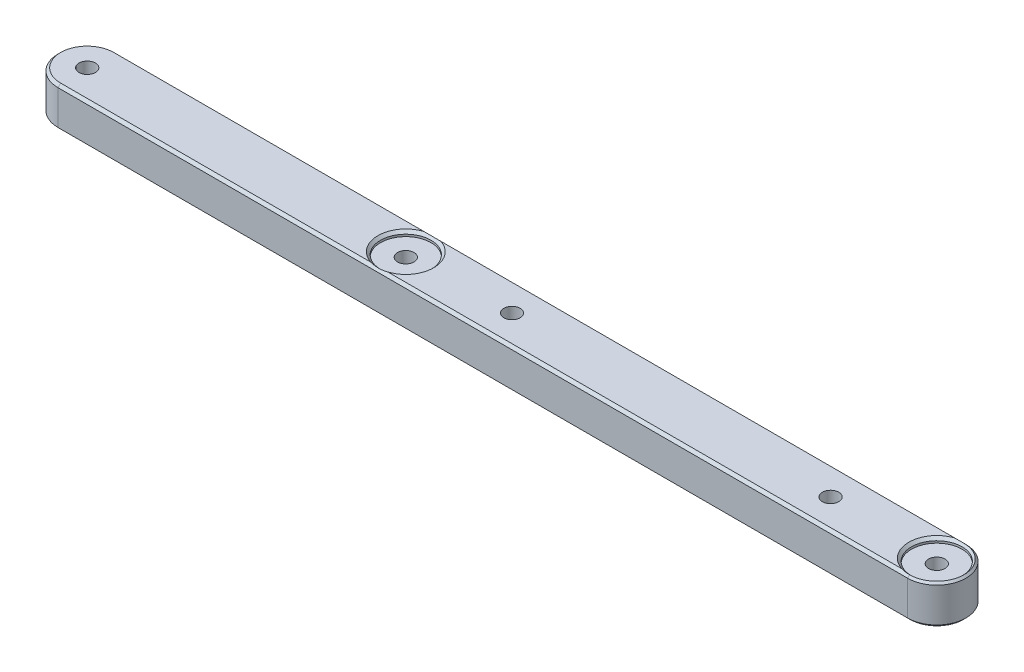
ISO-10303-21;
HEADER;
FILE_DESCRIPTION(('STEP AP214'),'2;1');
FILE_NAME('part.step','',(''),(''),'','','');
FILE_SCHEMA(('AUTOMOTIVE_DESIGN { 1 0 10303 214 1 1 1 1 }'));
ENDSEC;
DATA;
#1=APPLICATION_CONTEXT('core data for automotive mechanical design processes');
#2=APPLICATION_PROTOCOL_DEFINITION('international standard','automotive_design',2000,#1);
#3=PRODUCT_CONTEXT('',#1,'mechanical');
#4=PRODUCT('Part','Part','',(#3));
#5=PRODUCT_RELATED_PRODUCT_CATEGORY('part','',(#4));
#6=PRODUCT_DEFINITION_FORMATION('','',#4);
#7=PRODUCT_DEFINITION_CONTEXT('part definition',#1,'design');
#8=PRODUCT_DEFINITION('design','',#6,#7);
#9=PRODUCT_DEFINITION_SHAPE('','',#8);
#10=(LENGTH_UNIT() NAMED_UNIT(*) SI_UNIT(.MILLI.,.METRE.));
#11=(NAMED_UNIT(*) PLANE_ANGLE_UNIT() SI_UNIT($,.RADIAN.));
#12=(NAMED_UNIT(*) SI_UNIT($,.STERADIAN.) SOLID_ANGLE_UNIT());
#13=UNCERTAINTY_MEASURE_WITH_UNIT(LENGTH_MEASURE(1.E-05),#10,'distance_accuracy_value','');
#14=(GEOMETRIC_REPRESENTATION_CONTEXT(3) GLOBAL_UNCERTAINTY_ASSIGNED_CONTEXT((#13)) GLOBAL_UNIT_ASSIGNED_CONTEXT((#10,
#11,#12)) REPRESENTATION_CONTEXT('',''));
#15=CARTESIAN_POINT('',(0.,0.,0.));
#16=DIRECTION('',(0.,0.,1.));
#17=DIRECTION('',(1.,0.,0.));
#18=AXIS2_PLACEMENT_3D('',#15,#16,#17);
#19=CARTESIAN_POINT('',(-160.,15.,0.));
#20=DIRECTION('',(0.,1.,0.));
#21=DIRECTION('',(0.,0.,1.));
#22=AXIS2_PLACEMENT_3D('',#19,#20,#21);
#23=PLANE('',#22);
#24=CARTESIAN_POINT('',(0.,15.,0.));
#25=DIRECTION('',(0.,1.,0.));
#26=DIRECTION('',(0.,0.,1.));
#27=AXIS2_PLACEMENT_3D('',#24,#25,#26);
#28=CIRCLE('',#27,3.09999999999999);
#29=CARTESIAN_POINT('',(0.,15.,3.09999999999999));
#30=VERTEX_POINT('',#29);
#31=EDGE_CURVE('E543',#30,#30,#28,.T.);
#32=ORIENTED_EDGE('',*,*,#31,.F.);
#33=EDGE_LOOP('',(#32));
#34=FACE_BOUND('',#33,.T.);
#35=CARTESIAN_POINT('',(120.,15.,0.));
#36=DIRECTION('',(0.,1.,0.));
#37=DIRECTION('',(0.,0.,1.));
#38=AXIS2_PLACEMENT_3D('',#35,#36,#37);
#39=CIRCLE('',#38,3.09999999999999);
#40=CARTESIAN_POINT('',(120.,15.,3.09999999999999));
#41=VERTEX_POINT('',#40);
#42=EDGE_CURVE('E537',#41,#41,#39,.T.);
#43=ORIENTED_EDGE('',*,*,#42,.F.);
#44=EDGE_LOOP('',(#43));
#45=FACE_BOUND('',#44,.T.);
#46=CARTESIAN_POINT('',(-40.,15.,0.));
#47=DIRECTION('',(0.,1.,0.));
#48=DIRECTION('',(0.,0.,1.));
#49=AXIS2_PLACEMENT_3D('',#46,#47,#48);
#50=CIRCLE('',#49,10.5000000000001);
#51=CARTESIAN_POINT('',(-36.7984378812834,15.,-10.0000000000001));
#52=VERTEX_POINT('',#51);
#53=CARTESIAN_POINT('',(-36.7984378812833,15.,10.));
#54=VERTEX_POINT('',#53);
#55=EDGE_CURVE('E127',#52,#54,#50,.F.);
#56=ORIENTED_EDGE('',*,*,#55,.T.);
#57=DIRECTION('',(1.,0.,0.));
#58=VECTOR('',#57,1.);
#59=CARTESIAN_POINT('',(160.,15.,10.));
#60=LINE('',#59,#58);
#61=CARTESIAN_POINT('',(156.798437881283,15.,10.));
#62=VERTEX_POINT('',#61);
#63=EDGE_CURVE('E122',#54,#62,#60,.T.);
#64=ORIENTED_EDGE('',*,*,#63,.T.);
#65=CARTESIAN_POINT('',(160.,15.,0.));
#66=DIRECTION('',(0.,1.,0.));
#67=DIRECTION('',(0.,0.,1.));
#68=AXIS2_PLACEMENT_3D('',#65,#66,#67);
#69=CIRCLE('',#68,10.5000000000001);
#70=CARTESIAN_POINT('',(156.798437881283,15.,-10.0000000000001));
#71=VERTEX_POINT('',#70);
#72=EDGE_CURVE('E124',#62,#71,#69,.F.);
#73=ORIENTED_EDGE('',*,*,#72,.T.);
#74=DIRECTION('',(-1.,0.,0.));
#75=VECTOR('',#74,1.);
#76=CARTESIAN_POINT('',(-160.,15.,-10.0000000000001));
#77=LINE('',#76,#75);
#78=EDGE_CURVE('E131',#71,#52,#77,.T.);
#79=ORIENTED_EDGE('',*,*,#78,.T.);
#80=EDGE_LOOP('',(#56,#64,#73,#79));
#81=FACE_BOUND('',#80,.T.);
#82=ADVANCED_FACE('F35',(#34,#45,#81),#23,.T.);
#83=CARTESIAN_POINT('',(160.,15.,0.));
#84=DIRECTION('',(0.,-1.,0.));
#85=DIRECTION('',(0.,0.,-1.));
#86=AXIS2_PLACEMENT_3D('',#83,#84,#85);
#87=CYLINDRICAL_SURFACE('',#86,3.09999999999999);
#88=CARTESIAN_POINT('',(160.,0.,0.));
#89=DIRECTION('',(0.,1.,0.));
#90=DIRECTION('',(0.,0.,1.));
#91=AXIS2_PLACEMENT_3D('',#88,#89,#90);
#92=CIRCLE('',#91,3.09999999999999);
#93=CARTESIAN_POINT('',(160.,0.,3.09999999999993));
#94=VERTEX_POINT('',#93);
#95=EDGE_CURVE('E273',#94,#94,#92,.T.);
#96=ORIENTED_EDGE('',*,*,#95,.F.);
#97=EDGE_LOOP('',(#96));
#98=FACE_BOUND('',#97,.T.);
#99=CARTESIAN_POINT('',(160.,13.2,0.));
#100=DIRECTION('',(0.,1.,0.));
#101=DIRECTION('',(0.,0.,1.));
#102=AXIS2_PLACEMENT_3D('',#99,#100,#101);
#103=CIRCLE('',#102,3.09999999999999);
#104=CARTESIAN_POINT('',(160.,13.2,3.09999999999993));
#105=VERTEX_POINT('',#104);
#106=EDGE_CURVE('E290',#105,#105,#103,.T.);
#107=ORIENTED_EDGE('',*,*,#106,.T.);
#108=EDGE_LOOP('',(#107));
#109=FACE_BOUND('',#108,.T.);
#110=ADVANCED_FACE('F232',(#98,#109),#87,.F.);
#111=CARTESIAN_POINT('',(-40.,15.,0.));
#112=DIRECTION('',(0.,-1.,0.));
#113=DIRECTION('',(0.,0.,-1.));
#114=AXIS2_PLACEMENT_3D('',#111,#112,#113);
#115=CYLINDRICAL_SURFACE('',#114,3.1);
#116=CARTESIAN_POINT('',(-40.,0.,0.));
#117=DIRECTION('',(0.,1.,0.));
#118=DIRECTION('',(0.,0.,1.));
#119=AXIS2_PLACEMENT_3D('',#116,#117,#118);
#120=CIRCLE('',#119,3.1);
#121=CARTESIAN_POINT('',(-40.,0.,3.1));
#122=VERTEX_POINT('',#121);
#123=EDGE_CURVE('E294',#122,#122,#120,.T.);
#124=ORIENTED_EDGE('',*,*,#123,.F.);
#125=EDGE_LOOP('',(#124));
#126=FACE_BOUND('',#125,.T.);
#127=CARTESIAN_POINT('',(-40.,13.2,0.));
#128=DIRECTION('',(0.,1.,0.));
#129=DIRECTION('',(0.,0.,1.));
#130=AXIS2_PLACEMENT_3D('',#127,#128,#129);
#131=CIRCLE('',#130,3.1);
#132=CARTESIAN_POINT('',(-40.,13.2,3.1));
#133=VERTEX_POINT('',#132);
#134=EDGE_CURVE('E287',#133,#133,#131,.T.);
#135=ORIENTED_EDGE('',*,*,#134,.T.);
#136=EDGE_LOOP('',(#135));
#137=FACE_BOUND('',#136,.T.);
#138=ADVANCED_FACE('F239',(#126,#137),#115,.F.);
#139=CARTESIAN_POINT('',(-160.,15.,0.));
#140=DIRECTION('',(0.,1.,0.));
#141=DIRECTION('',(0.,0.,1.));
#142=AXIS2_PLACEMENT_3D('',#139,#140,#141);
#143=CIRCLE('',#142,10.0000000000001);
#144=CARTESIAN_POINT('',(-160.,15.,-10.0000000000001));
#145=VERTEX_POINT('',#144);
#146=CARTESIAN_POINT('',(-160.,15.,10.0000000000001));
#147=VERTEX_POINT('',#146);
#148=EDGE_CURVE('E260',#145,#147,#143,.T.);
#149=ORIENTED_EDGE('',*,*,#148,.T.);
#150=DIRECTION('',(1.,0.,0.));
#151=VECTOR('',#150,1.);
#152=CARTESIAN_POINT('',(160.,15.,10.));
#153=LINE('',#152,#151);
#154=CARTESIAN_POINT('',(-43.2015621187167,15.,10.));
#155=VERTEX_POINT('',#154);
#156=EDGE_CURVE('E304',#147,#155,#153,.T.);
#157=ORIENTED_EDGE('',*,*,#156,.T.);
#158=CARTESIAN_POINT('',(-43.2015621187166,15.,-10.0000000000001));
#159=VERTEX_POINT('',#158);
#160=EDGE_CURVE('E141',#155,#159,#50,.F.);
#161=ORIENTED_EDGE('',*,*,#160,.T.);
#162=DIRECTION('',(-1.,0.,0.));
#163=VECTOR('',#162,1.);
#164=CARTESIAN_POINT('',(-160.,15.,-10.0000000000001));
#165=LINE('',#164,#163);
#166=EDGE_CURVE('E301',#159,#145,#165,.T.);
#167=ORIENTED_EDGE('',*,*,#166,.T.);
#168=EDGE_LOOP('',(#149,#157,#161,#167));
#169=FACE_BOUND('',#168,.T.);
#170=CARTESIAN_POINT('',(-160.,15.,0.));
#171=DIRECTION('',(0.,1.,0.));
#172=DIRECTION('',(0.,0.,1.));
#173=AXIS2_PLACEMENT_3D('',#170,#171,#172);
#174=CIRCLE('',#173,3.09999999999999);
#175=CARTESIAN_POINT('',(-160.,15.,3.09999999999999));
#176=VERTEX_POINT('',#175);
#177=EDGE_CURVE('E264',#176,#176,#174,.T.);
#178=ORIENTED_EDGE('',*,*,#177,.F.);
#179=EDGE_LOOP('',(#178));
#180=FACE_BOUND('',#179,.T.);
#181=ADVANCED_FACE('F235',(#169,#180),#23,.T.);
#182=CARTESIAN_POINT('',(-160.,0.,0.));
#183=DIRECTION('',(0.,1.,0.));
#184=DIRECTION('',(0.,0.,1.));
#185=AXIS2_PLACEMENT_3D('',#182,#183,#184);
#186=PLANE('',#185);
#187=CARTESIAN_POINT('',(0.,0.,0.));
#188=DIRECTION('',(0.,1.,0.));
#189=DIRECTION('',(0.,0.,1.));
#190=AXIS2_PLACEMENT_3D('',#187,#188,#189);
#191=CIRCLE('',#190,3.09999999999999);
#192=CARTESIAN_POINT('',(0.,0.,3.09999999999999));
#193=VERTEX_POINT('',#192);
#194=EDGE_CURVE('E356',#193,#193,#191,.T.);
#195=ORIENTED_EDGE('',*,*,#194,.T.);
#196=EDGE_LOOP('',(#195));
#197=FACE_BOUND('',#196,.T.);
#198=CARTESIAN_POINT('',(120.,0.,0.));
#199=DIRECTION('',(0.,1.,0.));
#200=DIRECTION('',(0.,0.,1.));
#201=AXIS2_PLACEMENT_3D('',#198,#199,#200);
#202=CIRCLE('',#201,3.09999999999999);
#203=CARTESIAN_POINT('',(120.,0.,3.09999999999999));
#204=VERTEX_POINT('',#203);
#205=EDGE_CURVE('E540',#204,#204,#202,.T.);
#206=ORIENTED_EDGE('',*,*,#205,.T.);
#207=EDGE_LOOP('',(#206));
#208=FACE_BOUND('',#207,.T.);
#209=CARTESIAN_POINT('',(160.,0.,0.));
#210=DIRECTION('',(0.,1.,0.));
#211=DIRECTION('',(0.,0.,1.));
#212=AXIS2_PLACEMENT_3D('',#209,#210,#211);
#213=CIRCLE('',#212,10.0000000000001);
#214=CARTESIAN_POINT('',(160.,0.,-10.0000000000001));
#215=VERTEX_POINT('',#214);
#216=CARTESIAN_POINT('',(160.,0.,10.));
#217=VERTEX_POINT('',#216);
#218=EDGE_CURVE('E45',#215,#217,#213,.F.);
#219=ORIENTED_EDGE('',*,*,#218,.T.);
#220=DIRECTION('',(-1.,0.,0.));
#221=VECTOR('',#220,1.);
#222=CARTESIAN_POINT('',(-160.,0.,10.0000000000001));
#223=LINE('',#222,#221);
#224=CARTESIAN_POINT('',(-160.,0.,10.0000000000001));
#225=VERTEX_POINT('',#224);
#226=EDGE_CURVE('E11',#217,#225,#223,.T.);
#227=ORIENTED_EDGE('',*,*,#226,.T.);
#228=CARTESIAN_POINT('',(-160.,0.,0.));
#229=DIRECTION('',(0.,1.,0.));
#230=DIRECTION('',(0.,0.,1.));
#231=AXIS2_PLACEMENT_3D('',#228,#229,#230);
#232=CIRCLE('',#231,10.0000000000001);
#233=CARTESIAN_POINT('',(-160.,0.,-10.0000000000001));
#234=VERTEX_POINT('',#233);
#235=EDGE_CURVE('E346',#225,#234,#232,.F.);
#236=ORIENTED_EDGE('',*,*,#235,.T.);
#237=DIRECTION('',(1.,0.,0.));
#238=VECTOR('',#237,1.);
#239=CARTESIAN_POINT('',(-160.,0.,-10.0000000000001));
#240=LINE('',#239,#238);
#241=EDGE_CURVE('E344',#234,#215,#240,.T.);
#242=ORIENTED_EDGE('',*,*,#241,.T.);
#243=EDGE_LOOP('',(#219,#227,#236,#242));
#244=FACE_BOUND('',#243,.T.);
#245=CARTESIAN_POINT('',(-160.,0.,0.));
#246=DIRECTION('',(0.,1.,0.));
#247=DIRECTION('',(0.,0.,1.));
#248=AXIS2_PLACEMENT_3D('',#245,#246,#247);
#249=CIRCLE('',#248,3.09999999999999);
#250=CARTESIAN_POINT('',(-160.,0.,3.09999999999999));
#251=VERTEX_POINT('',#250);
#252=EDGE_CURVE('E267',#251,#251,#249,.T.);
#253=ORIENTED_EDGE('',*,*,#252,.T.);
#254=EDGE_LOOP('',(#253));
#255=FACE_BOUND('',#254,.T.);
#256=ORIENTED_EDGE('',*,*,#95,.T.);
#257=EDGE_LOOP('',(#256));
#258=FACE_BOUND('',#257,.T.);
#259=ORIENTED_EDGE('',*,*,#123,.T.);
#260=EDGE_LOOP('',(#259));
#261=FACE_BOUND('',#260,.T.);
#262=ADVANCED_FACE('F247',(#197,#208,#244,#255,#258,#261),#186,.F.);
#263=CARTESIAN_POINT('',(-160.,15.,0.));
#264=DIRECTION('',(0.,-1.,0.));
#265=DIRECTION('',(0.,0.,-1.));
#266=AXIS2_PLACEMENT_3D('',#263,#264,#265);
#267=CYLINDRICAL_SURFACE('',#266,11.0000000000001);
#268=DIRECTION('',(0.,-1.,0.));
#269=VECTOR('',#268,1.);
#270=CARTESIAN_POINT('',(-160.,15.,11.0000000000001));
#271=LINE('',#270,#269);
#272=CARTESIAN_POINT('',(-160.,14.,11.0000000000001));
#273=VERTEX_POINT('',#272);
#274=CARTESIAN_POINT('',(-160.,1.,11.0000000000001));
#275=VERTEX_POINT('',#274);
#276=EDGE_CURVE('E283',#273,#275,#271,.T.);
#277=ORIENTED_EDGE('',*,*,#276,.F.);
#278=CARTESIAN_POINT('',(-160.,14.,0.));
#279=DIRECTION('',(0.,1.,0.));
#280=DIRECTION('',(0.,0.,1.));
#281=AXIS2_PLACEMENT_3D('',#278,#279,#280);
#282=CIRCLE('',#281,11.0000000000001);
#283=CARTESIAN_POINT('',(-160.,14.,-11.0000000000001));
#284=VERTEX_POINT('',#283);
#285=EDGE_CURVE('E323',#273,#284,#282,.F.);
#286=ORIENTED_EDGE('',*,*,#285,.T.);
#287=DIRECTION('',(0.,-1.,0.));
#288=VECTOR('',#287,1.);
#289=CARTESIAN_POINT('',(-160.,15.,-11.0000000000001));
#290=LINE('',#289,#288);
#291=CARTESIAN_POINT('',(-160.,1.,-11.0000000000001));
#292=VERTEX_POINT('',#291);
#293=EDGE_CURVE('E266',#284,#292,#290,.T.);
#294=ORIENTED_EDGE('',*,*,#293,.T.);
#295=CARTESIAN_POINT('',(-160.,1.,0.));
#296=DIRECTION('',(0.,1.,0.));
#297=DIRECTION('',(0.,0.,1.));
#298=AXIS2_PLACEMENT_3D('',#295,#296,#297);
#299=CIRCLE('',#298,11.0000000000001);
#300=EDGE_CURVE('E328',#292,#275,#299,.T.);
#301=ORIENTED_EDGE('',*,*,#300,.T.);
#302=EDGE_LOOP('',(#277,#286,#294,#301));
#303=FACE_BOUND('',#302,.T.);
#304=ADVANCED_FACE('F253',(#303),#267,.T.);
#305=CARTESIAN_POINT('',(-160.,15.,11.0000000000001));
#306=DIRECTION('',(0.,0.,-1.));
#307=DIRECTION('',(-1.,0.,0.));
#308=AXIS2_PLACEMENT_3D('',#305,#306,#307);
#309=PLANE('',#308);
#310=DIRECTION('',(0.,-1.,0.));
#311=VECTOR('',#310,1.);
#312=CARTESIAN_POINT('',(160.,15.,11.));
#313=LINE('',#312,#311);
#314=CARTESIAN_POINT('',(160.,14.,11.));
#315=VERTEX_POINT('',#314);
#316=CARTESIAN_POINT('',(160.,1.,11.));
#317=VERTEX_POINT('',#316);
#318=EDGE_CURVE('E280',#315,#317,#313,.T.);
#319=ORIENTED_EDGE('',*,*,#318,.F.);
#320=DIRECTION('',(-1.,0.,0.));
#321=VECTOR('',#320,1.);
#322=CARTESIAN_POINT('',(-160.,14.,11.0000000000001));
#323=LINE('',#322,#321);
#324=EDGE_CURVE('E152',#315,#273,#323,.T.);
#325=ORIENTED_EDGE('',*,*,#324,.T.);
#326=ORIENTED_EDGE('',*,*,#276,.T.);
#327=DIRECTION('',(1.,0.,0.));
#328=VECTOR('',#327,1.);
#329=CARTESIAN_POINT('',(-160.,1.,11.0000000000001));
#330=LINE('',#329,#328);
#331=EDGE_CURVE('E148',#275,#317,#330,.T.);
#332=ORIENTED_EDGE('',*,*,#331,.T.);
#333=EDGE_LOOP('',(#319,#325,#326,#332));
#334=FACE_BOUND('',#333,.T.);
#335=ADVANCED_FACE('F332',(#334),#309,.F.);
#336=CARTESIAN_POINT('',(160.,15.,0.));
#337=DIRECTION('',(0.,-1.,0.));
#338=DIRECTION('',(0.,0.,-1.));
#339=AXIS2_PLACEMENT_3D('',#336,#337,#338);
#340=CYLINDRICAL_SURFACE('',#339,11.0000000000001);
#341=DIRECTION('',(0.,-1.,0.));
#342=VECTOR('',#341,1.);
#343=CARTESIAN_POINT('',(160.,15.,-11.0000000000001));
#344=LINE('',#343,#342);
#345=CARTESIAN_POINT('',(160.,14.,-11.0000000000001));
#346=VERTEX_POINT('',#345);
#347=CARTESIAN_POINT('',(160.,1.,-11.0000000000001));
#348=VERTEX_POINT('',#347);
#349=EDGE_CURVE('E270',#346,#348,#344,.T.);
#350=ORIENTED_EDGE('',*,*,#349,.F.);
#351=CARTESIAN_POINT('',(160.,14.,0.));
#352=DIRECTION('',(0.,1.,0.));
#353=DIRECTION('',(0.,0.,1.));
#354=AXIS2_PLACEMENT_3D('',#351,#352,#353);
#355=CIRCLE('',#354,11.0000000000001);
#356=EDGE_CURVE('E336',#346,#315,#355,.F.);
#357=ORIENTED_EDGE('',*,*,#356,.T.);
#358=ORIENTED_EDGE('',*,*,#318,.T.);
#359=CARTESIAN_POINT('',(160.,1.,0.));
#360=DIRECTION('',(0.,1.,0.));
#361=DIRECTION('',(0.,0.,1.));
#362=AXIS2_PLACEMENT_3D('',#359,#360,#361);
#363=CIRCLE('',#362,11.0000000000001);
#364=EDGE_CURVE('E333',#317,#348,#363,.T.);
#365=ORIENTED_EDGE('',*,*,#364,.T.);
#366=EDGE_LOOP('',(#350,#357,#358,#365));
#367=FACE_BOUND('',#366,.T.);
#368=ADVANCED_FACE('F367',(#367),#340,.T.);
#369=CARTESIAN_POINT('',(-160.,15.,-11.0000000000001));
#370=DIRECTION('',(0.,0.,1.));
#371=DIRECTION('',(1.,0.,0.));
#372=AXIS2_PLACEMENT_3D('',#369,#370,#371);
#373=PLANE('',#372);
#374=ORIENTED_EDGE('',*,*,#293,.F.);
#375=DIRECTION('',(1.,0.,0.));
#376=VECTOR('',#375,1.);
#377=CARTESIAN_POINT('',(160.,14.,-11.0000000000001));
#378=LINE('',#377,#376);
#379=EDGE_CURVE('E342',#284,#346,#378,.T.);
#380=ORIENTED_EDGE('',*,*,#379,.T.);
#381=ORIENTED_EDGE('',*,*,#349,.T.);
#382=DIRECTION('',(-1.,0.,0.));
#383=VECTOR('',#382,1.);
#384=CARTESIAN_POINT('',(-160.,1.,-11.0000000000001));
#385=LINE('',#384,#383);
#386=EDGE_CURVE('E327',#348,#292,#385,.T.);
#387=ORIENTED_EDGE('',*,*,#386,.T.);
#388=EDGE_LOOP('',(#374,#380,#381,#387));
#389=FACE_BOUND('',#388,.T.);
#390=ADVANCED_FACE('F371',(#389),#373,.F.);
#391=CARTESIAN_POINT('',(-160.,15.,0.));
#392=DIRECTION('',(0.,-1.,0.));
#393=DIRECTION('',(0.,0.,-1.));
#394=AXIS2_PLACEMENT_3D('',#391,#392,#393);
#395=CYLINDRICAL_SURFACE('',#394,3.09999999999999);
#396=ORIENTED_EDGE('',*,*,#177,.T.);
#397=EDGE_LOOP('',(#396));
#398=FACE_BOUND('',#397,.T.);
#399=ORIENTED_EDGE('',*,*,#252,.F.);
#400=EDGE_LOOP('',(#399));
#401=FACE_BOUND('',#400,.T.);
#402=ADVANCED_FACE('F373',(#398,#401),#395,.F.);
#403=CARTESIAN_POINT('',(-40.,13.2,0.));
#404=DIRECTION('',(0.,1.,0.));
#405=DIRECTION('',(0.,0.,1.));
#406=AXIS2_PLACEMENT_3D('',#403,#404,#405);
#407=CYLINDRICAL_SURFACE('',#406,9.49999999999999);
#408=CARTESIAN_POINT('',(-40.,13.9999999999999,0.));
#409=DIRECTION('',(0.,1.,0.));
#410=DIRECTION('',(0.,0.,1.));
#411=AXIS2_PLACEMENT_3D('',#408,#409,#410);
#412=CIRCLE('',#411,9.49999999999999);
#413=CARTESIAN_POINT('',(-40.,13.9999999999999,9.49999999999999));
#414=VERTEX_POINT('',#413);
#415=EDGE_CURVE('E140',#414,#414,#412,.T.);
#416=ORIENTED_EDGE('',*,*,#415,.T.);
#417=EDGE_LOOP('',(#416));
#418=FACE_BOUND('',#417,.T.);
#419=CARTESIAN_POINT('',(-40.,13.2,0.));
#420=DIRECTION('',(0.,1.,0.));
#421=DIRECTION('',(0.,0.,1.));
#422=AXIS2_PLACEMENT_3D('',#419,#420,#421);
#423=CIRCLE('',#422,9.49999999999999);
#424=CARTESIAN_POINT('',(-40.,13.2,9.49999999999999));
#425=VERTEX_POINT('',#424);
#426=EDGE_CURVE('E353',#425,#425,#423,.T.);
#427=ORIENTED_EDGE('',*,*,#426,.F.);
#428=EDGE_LOOP('',(#427));
#429=FACE_BOUND('',#428,.T.);
#430=ADVANCED_FACE('F379',(#418,#429),#407,.F.);
#431=CARTESIAN_POINT('',(-40.,13.2,0.));
#432=DIRECTION('',(0.,1.,0.));
#433=DIRECTION('',(0.,0.,1.));
#434=AXIS2_PLACEMENT_3D('',#431,#432,#433);
#435=PLANE('',#434);
#436=ORIENTED_EDGE('',*,*,#134,.F.);
#437=EDGE_LOOP('',(#436));
#438=FACE_BOUND('',#437,.T.);
#439=ORIENTED_EDGE('',*,*,#426,.T.);
#440=EDGE_LOOP('',(#439));
#441=FACE_BOUND('',#440,.T.);
#442=ADVANCED_FACE('F506',(#438,#441),#435,.T.);
#443=CARTESIAN_POINT('',(160.,13.2,0.));
#444=DIRECTION('',(0.,1.,0.));
#445=DIRECTION('',(0.,0.,1.));
#446=AXIS2_PLACEMENT_3D('',#443,#444,#445);
#447=CYLINDRICAL_SURFACE('',#446,9.50000000000001);
#448=CARTESIAN_POINT('',(160.,13.9999999999999,0.));
#449=DIRECTION('',(0.,1.,0.));
#450=DIRECTION('',(0.,0.,1.));
#451=AXIS2_PLACEMENT_3D('',#448,#449,#450);
#452=CIRCLE('',#451,9.50000000000001);
#453=CARTESIAN_POINT('',(160.,13.9999999999999,9.49999999999995));
#454=VERTEX_POINT('',#453);
#455=EDGE_CURVE('E286',#454,#454,#452,.T.);
#456=ORIENTED_EDGE('',*,*,#455,.T.);
#457=EDGE_LOOP('',(#456));
#458=FACE_BOUND('',#457,.T.);
#459=CARTESIAN_POINT('',(160.,13.2,0.));
#460=DIRECTION('',(0.,1.,0.));
#461=DIRECTION('',(0.,0.,1.));
#462=AXIS2_PLACEMENT_3D('',#459,#460,#461);
#463=CIRCLE('',#462,9.50000000000001);
#464=CARTESIAN_POINT('',(160.,13.2,9.49999999999995));
#465=VERTEX_POINT('',#464);
#466=EDGE_CURVE('E291',#465,#465,#463,.T.);
#467=ORIENTED_EDGE('',*,*,#466,.F.);
#468=EDGE_LOOP('',(#467));
#469=FACE_BOUND('',#468,.T.);
#470=ADVANCED_FACE('F502',(#458,#469),#447,.F.);
#471=CARTESIAN_POINT('',(160.,13.2,0.));
#472=DIRECTION('',(0.,1.,0.));
#473=DIRECTION('',(0.,0.,1.));
#474=AXIS2_PLACEMENT_3D('',#471,#472,#473);
#475=PLANE('',#474);
#476=ORIENTED_EDGE('',*,*,#106,.F.);
#477=EDGE_LOOP('',(#476));
#478=FACE_BOUND('',#477,.T.);
#479=ORIENTED_EDGE('',*,*,#466,.T.);
#480=EDGE_LOOP('',(#479));
#481=FACE_BOUND('',#480,.T.);
#482=ADVANCED_FACE('F410',(#478,#481),#475,.T.);
#483=CARTESIAN_POINT('',(160.,13.9999999999999,0.));
#484=DIRECTION('',(0.,1.,0.));
#485=DIRECTION('',(0.,0.,1.));
#486=AXIS2_PLACEMENT_3D('',#483,#484,#485);
#487=CONICAL_SURFACE('',#486,9.50000000000001,0.78539816339746);
#488=ORIENTED_EDGE('',*,*,#72,.F.);
#489=CARTESIAN_POINT('',(156.798437881283,15.,10.));
#490=CARTESIAN_POINT('',(157.061417668574,14.9589117283557,10.0410882716443));
#491=CARTESIAN_POINT('',(157.325935597256,14.9226792352759,10.0773207647241));
#492=CARTESIAN_POINT('',(157.856541445311,14.8603515668819,10.1396484331181));
#493=CARTESIAN_POINT('',(158.122622399107,14.8342267000183,10.1657732999817));
#494=CARTESIAN_POINT('',(158.656439951664,14.7922908527751,10.2077091472249));
#495=CARTESIAN_POINT('',(158.924176711871,14.7764808946568,10.2235191053432));
#496=CARTESIAN_POINT('',(159.461271085149,14.7553090668908,10.2446909331092));
#497=CARTESIAN_POINT('',(159.730631150446,14.7499783581795,10.2500216418205));
#498=CARTESIAN_POINT('',(160.,14.75,10.25));
#499=B_SPLINE_CURVE_WITH_KNOTS('',3,(#489,#490,#491,#492,#493,#494,#495,#496,#497,#498),
.UNSPECIFIED.,.F.,.F.,(4,2,2,2,4),(0.,0.807907442958419,1.61342327279023,2.41901892131209,
3.22700647482159),.UNSPECIFIED.);
#500=CARTESIAN_POINT('',(160.,14.75,10.25));
#501=VERTEX_POINT('',#500);
#502=EDGE_CURVE('E136',#62,#501,#499,.T.);
#503=ORIENTED_EDGE('',*,*,#502,.T.);
#504=CARTESIAN_POINT('',(160.,14.75,0.));
#505=DIRECTION('',(0.,-1.,0.));
#506=DIRECTION('',(0.,0.,-1.));
#507=AXIS2_PLACEMENT_3D('',#504,#505,#506);
#508=CIRCLE('',#507,10.2500000000001);
#509=CARTESIAN_POINT('',(160.,14.75,-10.2500000000002));
#510=VERTEX_POINT('',#509);
#511=EDGE_CURVE('E149',#501,#510,#508,.F.);
#512=ORIENTED_EDGE('',*,*,#511,.T.);
#513=CARTESIAN_POINT('',(160.,14.75,-10.2500000000002));
#514=CARTESIAN_POINT('',(159.730631150446,14.7499783581795,-10.2500216418207));
#515=CARTESIAN_POINT('',(159.461271085149,14.7553090668908,-10.2446909331093));
#516=CARTESIAN_POINT('',(158.924176711871,14.7764808946568,-10.2235191053433));
#517=CARTESIAN_POINT('',(158.656439951664,14.7922908527751,-10.207709147225));
#518=CARTESIAN_POINT('',(158.122622399107,14.8342267000183,-10.1657732999818));
#519=CARTESIAN_POINT('',(157.856541445311,14.8603515668819,-10.1396484331182));
#520=CARTESIAN_POINT('',(157.325935597256,14.9226792352759,-10.0773207647243));
#521=CARTESIAN_POINT('',(157.061417668574,14.9589117283557,-10.0410882716444));
#522=CARTESIAN_POINT('',(156.798437881283,15.,-10.0000000000001));
#523=B_SPLINE_CURVE_WITH_KNOTS('',3,(#513,#514,#515,#516,#517,#518,#519,#520,#521,#522),
.UNSPECIFIED.,.F.,.F.,(4,2,2,2,4),(0.,0.807987553509503,1.61358320203136,2.41909903186317,
3.22700647482159),.UNSPECIFIED.);
#524=EDGE_CURVE('E139',#510,#71,#523,.T.);
#525=ORIENTED_EDGE('',*,*,#524,.T.);
#526=EDGE_LOOP('',(#488,#503,#512,#525));
#527=FACE_BOUND('',#526,.T.);
#528=ORIENTED_EDGE('',*,*,#455,.F.);
#529=EDGE_LOOP('',(#528));
#530=FACE_BOUND('',#529,.T.);
#531=ADVANCED_FACE('F134',(#527,#530),#487,.F.);
#532=CARTESIAN_POINT('',(-40.,13.9999999999999,0.));
#533=DIRECTION('',(0.,1.,0.));
#534=DIRECTION('',(0.,0.,1.));
#535=AXIS2_PLACEMENT_3D('',#532,#533,#534);
#536=CONICAL_SURFACE('',#535,9.49999999999999,0.785398163397459);
#537=ORIENTED_EDGE('',*,*,#160,.F.);
#538=CARTESIAN_POINT('',(-43.2015621187167,15.,10.));
#539=CARTESIAN_POINT('',(-42.9957068927583,14.9678440804905,10.0321559195095));
#540=CARTESIAN_POINT('',(-42.7889175011186,14.9386563246628,10.0613436753372));
#541=CARTESIAN_POINT('',(-42.3737834533765,14.8863861284822,10.1136138715178));
#542=CARTESIAN_POINT('',(-42.1654386603915,14.8633042321445,10.1366957678555));
#543=CARTESIAN_POINT('',(-41.7474335000613,14.8234100181417,10.1765899818583));
#544=CARTESIAN_POINT('',(-41.5377724970122,14.8066010124462,10.1933989875538));
#545=CARTESIAN_POINT('',(-41.1176414483812,14.7793895146702,10.2206104853299));
#546=CARTESIAN_POINT('',(-40.9071714371559,14.7689867534905,10.2310132465096));
#547=CARTESIAN_POINT('',(-40.2827782609922,14.7477813358645,10.2522186641355));
#548=CARTESIAN_POINT('',(-39.8681533838958,14.7462446983299,10.2537553016701));
#549=CARTESIAN_POINT('',(-39.0405020600124,14.7682800929346,10.2317199070655));
#550=CARTESIAN_POINT('',(-38.6274747414774,14.7918356161913,10.2081643838087));
#551=CARTESIAN_POINT('',(-38.0979444894393,14.8378942189092,10.1621057810908));
#552=CARTESIAN_POINT('',(-37.9793638152036,14.8492425593637,10.1507574406364));
#553=CARTESIAN_POINT('',(-37.7426342277274,14.8739440350267,10.1260559649734));
#554=CARTESIAN_POINT('',(-37.6244852471063,14.8872968423646,10.1127031576354));
#555=CARTESIAN_POINT('',(-37.3880366438044,14.9160560535094,10.0839439464906));
#556=CARTESIAN_POINT('',(-37.2697396220305,14.9314731048647,10.0685268951354));
#557=CARTESIAN_POINT('',(-37.0336738925455,14.9642719876244,10.0357280123757));
#558=CARTESIAN_POINT('',(-36.9159052626895,14.9816540992834,10.0183459007166));
#559=CARTESIAN_POINT('',(-36.7984378812833,15.,10.));
#560=B_SPLINE_CURVE_WITH_KNOTS('',3,(#538,#539,#540,#541,#542,#543,#544,#545,#546,#547,#548,
#549,#550,#551,#552,#553,#554,#555,#556,#557,#558,#559),.UNSPECIFIED.,.F.,.F.,(4,2,2,2,2,2,2,2,
2,2,4),(0.,0.632420492277402,1.26489731251183,1.89770759787709,2.53049129975194,
3.77277201326076,5.01423589768986,5.37320208469399,5.73210961944639,6.09294538746054,
6.45383268253882),.UNSPECIFIED.);
#561=EDGE_CURVE('E181',#155,#54,#560,.T.);
#562=ORIENTED_EDGE('',*,*,#561,.T.);
#563=ORIENTED_EDGE('',*,*,#55,.F.);
#564=CARTESIAN_POINT('',(-36.7984378812834,15.,-10.0000000000001));
#565=CARTESIAN_POINT('',(-37.0042931072418,14.9678440804905,-10.0321559195095));
#566=CARTESIAN_POINT('',(-37.2110824988816,14.9386563246628,-10.0613436753372));
#567=CARTESIAN_POINT('',(-37.6262165466236,14.8863861284822,-10.1136138715179));
#568=CARTESIAN_POINT('',(-37.8345613396087,14.8633042321446,-10.1366957678555));
#569=CARTESIAN_POINT('',(-38.2525664999388,14.8234100181417,-10.1765899818583));
#570=CARTESIAN_POINT('',(-38.4622275029879,14.8066010124462,-10.1933989875539));
#571=CARTESIAN_POINT('',(-38.882358551619,14.7793895146702,-10.2206104853299));
#572=CARTESIAN_POINT('',(-39.0928285628442,14.7689867534905,-10.2310132465096));
#573=CARTESIAN_POINT('',(-39.7172217390079,14.7477813358645,-10.2522186641356));
#574=CARTESIAN_POINT('',(-40.1318466161043,14.74624469833,-10.2537553016701));
#575=CARTESIAN_POINT('',(-40.9594979399877,14.7682800929346,-10.2317199070655));
#576=CARTESIAN_POINT('',(-41.3725252585227,14.7918356161913,-10.2081643838087));
#577=CARTESIAN_POINT('',(-41.9020555105608,14.8378942189093,-10.1621057810908));
#578=CARTESIAN_POINT('',(-42.0206361847965,14.8492425593637,-10.1507574406364));
#579=CARTESIAN_POINT('',(-42.2573657722726,14.8739440350267,-10.1260559649734));
#580=CARTESIAN_POINT('',(-42.3755147528937,14.8872968423646,-10.1127031576355));
#581=CARTESIAN_POINT('',(-42.6119633561956,14.9160560535094,-10.0839439464906));
#582=CARTESIAN_POINT('',(-42.7302603779695,14.9314731048647,-10.0685268951354));
#583=CARTESIAN_POINT('',(-42.9663261074544,14.9642719876244,-10.0357280123757));
#584=CARTESIAN_POINT('',(-43.0840947373104,14.9816540992834,-10.0183459007166));
#585=CARTESIAN_POINT('',(-43.2015621187166,15.,-10.0000000000001));
#586=B_SPLINE_CURVE_WITH_KNOTS('',3,(#564,#565,#566,#567,#568,#569,#570,#571,#572,#573,#574,
#575,#576,#577,#578,#579,#580,#581,#582,#583,#584,#585),.UNSPECIFIED.,.F.,.F.,(4,2,2,2,2,2,2,2,
2,2,4),(0.,0.6324204922774,1.26489731251183,1.89770759787708,2.53049129975194,3.77277201326075,
5.01423589768984,5.3732020846939,5.73210961944623,6.09294538746032,6.45383268253853),.UNSPECIFIED.);
#587=EDGE_CURVE('E130',#52,#159,#586,.T.);
#588=ORIENTED_EDGE('',*,*,#587,.T.);
#589=EDGE_LOOP('',(#537,#562,#563,#588));
#590=FACE_BOUND('',#589,.T.);
#591=ORIENTED_EDGE('',*,*,#415,.F.);
#592=EDGE_LOOP('',(#591));
#593=FACE_BOUND('',#592,.T.);
#594=ADVANCED_FACE('F176',(#590,#593),#536,.F.);
#595=CARTESIAN_POINT('',(-160.,15.,-10.0000000000001));
#596=DIRECTION('',(0.,0.707106781186557,-0.707106781186538));
#597=DIRECTION('',(1.,0.,0.));
#598=AXIS2_PLACEMENT_3D('',#595,#596,#597);
#599=PLANE('',#598);
#600=DIRECTION('',(0.,0.707106781186538,0.707106781186557));
#601=VECTOR('',#600,1.);
#602=CARTESIAN_POINT('',(160.,14.,-11.0000000000001));
#603=LINE('',#602,#601);
#604=EDGE_CURVE('E321',#346,#510,#603,.T.);
#605=ORIENTED_EDGE('',*,*,#604,.F.);
#606=ORIENTED_EDGE('',*,*,#379,.F.);
#607=DIRECTION('',(0.,-0.707106781186538,-0.707106781186557));
#608=VECTOR('',#607,1.);
#609=CARTESIAN_POINT('',(-160.,15.,-10.0000000000001));
#610=LINE('',#609,#608);
#611=EDGE_CURVE('E315',#145,#284,#610,.T.);
#612=ORIENTED_EDGE('',*,*,#611,.F.);
#613=ORIENTED_EDGE('',*,*,#166,.F.);
#614=ORIENTED_EDGE('',*,*,#587,.F.);
#615=ORIENTED_EDGE('',*,*,#78,.F.);
#616=ORIENTED_EDGE('',*,*,#524,.F.);
#617=EDGE_LOOP('',(#605,#606,#612,#613,#614,#615,#616));
#618=FACE_BOUND('',#617,.T.);
#619=ADVANCED_FACE('F197',(#618),#599,.T.);
#620=CARTESIAN_POINT('',(-160.,15.,0.));
#621=DIRECTION('',(0.,-1.,0.));
#622=DIRECTION('',(0.,0.,-1.));
#623=AXIS2_PLACEMENT_3D('',#620,#621,#622);
#624=CONICAL_SURFACE('',#623,10.0000000000001,0.785398163397462);
#625=ORIENTED_EDGE('',*,*,#611,.T.);
#626=ORIENTED_EDGE('',*,*,#285,.F.);
#627=DIRECTION('',(0.,-0.707106781186538,0.707106781186557));
#628=VECTOR('',#627,1.);
#629=CARTESIAN_POINT('',(-160.,15.,10.0000000000001));
#630=LINE('',#629,#628);
#631=EDGE_CURVE('E317',#147,#273,#630,.T.);
#632=ORIENTED_EDGE('',*,*,#631,.F.);
#633=ORIENTED_EDGE('',*,*,#148,.F.);
#634=EDGE_LOOP('',(#625,#626,#632,#633));
#635=FACE_BOUND('',#634,.T.);
#636=ADVANCED_FACE('F204',(#635),#624,.T.);
#637=CARTESIAN_POINT('',(160.,15.,0.));
#638=DIRECTION('',(0.,-1.,0.));
#639=DIRECTION('',(0.,0.,-1.));
#640=AXIS2_PLACEMENT_3D('',#637,#638,#639);
#641=CONICAL_SURFACE('',#640,10.0000000000001,0.785398163397462);
#642=ORIENTED_EDGE('',*,*,#604,.T.);
#643=ORIENTED_EDGE('',*,*,#511,.F.);
#644=DIRECTION('',(0.,0.707106781186538,-0.707106781186557));
#645=VECTOR('',#644,1.);
#646=CARTESIAN_POINT('',(160.,14.,11.));
#647=LINE('',#646,#645);
#648=EDGE_CURVE('E147',#315,#501,#647,.T.);
#649=ORIENTED_EDGE('',*,*,#648,.F.);
#650=ORIENTED_EDGE('',*,*,#356,.F.);
#651=EDGE_LOOP('',(#642,#643,#649,#650));
#652=FACE_BOUND('',#651,.T.);
#653=ADVANCED_FACE('F174',(#652),#641,.T.);
#654=CARTESIAN_POINT('',(-160.,15.,10.0000000000001));
#655=DIRECTION('',(0.,0.707106781186557,0.707106781186538));
#656=DIRECTION('',(-1.,0.,0.));
#657=AXIS2_PLACEMENT_3D('',#654,#655,#656);
#658=PLANE('',#657);
#659=ORIENTED_EDGE('',*,*,#631,.T.);
#660=ORIENTED_EDGE('',*,*,#324,.F.);
#661=ORIENTED_EDGE('',*,*,#648,.T.);
#662=ORIENTED_EDGE('',*,*,#502,.F.);
#663=ORIENTED_EDGE('',*,*,#63,.F.);
#664=ORIENTED_EDGE('',*,*,#561,.F.);
#665=ORIENTED_EDGE('',*,*,#156,.F.);
#666=EDGE_LOOP('',(#659,#660,#661,#662,#663,#664,#665));
#667=FACE_BOUND('',#666,.T.);
#668=ADVANCED_FACE('F144',(#667),#658,.T.);
#669=CARTESIAN_POINT('',(-160.,1.,-11.0000000000001));
#670=DIRECTION('',(0.,0.707106781186538,0.707106781186557));
#671=DIRECTION('',(-1.,0.,0.));
#672=AXIS2_PLACEMENT_3D('',#669,#670,#671);
#673=PLANE('',#672);
#674=DIRECTION('',(0.,0.707106781186557,-0.707106781186538));
#675=VECTOR('',#674,1.);
#676=CARTESIAN_POINT('',(160.,0.,-10.0000000000001));
#677=LINE('',#676,#675);
#678=EDGE_CURVE('E357',#215,#348,#677,.T.);
#679=ORIENTED_EDGE('',*,*,#678,.F.);
#680=ORIENTED_EDGE('',*,*,#241,.F.);
#681=DIRECTION('',(0.,-0.707106781186557,0.707106781186538));
#682=VECTOR('',#681,1.);
#683=CARTESIAN_POINT('',(-160.,1.,-11.0000000000001));
#684=LINE('',#683,#682);
#685=EDGE_CURVE('E40',#292,#234,#684,.T.);
#686=ORIENTED_EDGE('',*,*,#685,.F.);
#687=ORIENTED_EDGE('',*,*,#386,.F.);
#688=EDGE_LOOP('',(#679,#680,#686,#687));
#689=FACE_BOUND('',#688,.T.);
#690=ADVANCED_FACE('F38',(#689),#673,.F.);
#691=CARTESIAN_POINT('',(-160.,1.,0.));
#692=DIRECTION('',(0.,1.,0.));
#693=DIRECTION('',(0.,0.,1.));
#694=AXIS2_PLACEMENT_3D('',#691,#692,#693);
#695=CONICAL_SURFACE('',#694,11.0000000000001,0.785398163397435);
#696=ORIENTED_EDGE('',*,*,#685,.T.);
#697=ORIENTED_EDGE('',*,*,#235,.F.);
#698=DIRECTION('',(0.,-0.707106781186557,-0.707106781186538));
#699=VECTOR('',#698,1.);
#700=CARTESIAN_POINT('',(-160.,1.,11.0000000000001));
#701=LINE('',#700,#699);
#702=EDGE_CURVE('E58',#275,#225,#701,.T.);
#703=ORIENTED_EDGE('',*,*,#702,.F.);
#704=ORIENTED_EDGE('',*,*,#300,.F.);
#705=EDGE_LOOP('',(#696,#697,#703,#704));
#706=FACE_BOUND('',#705,.T.);
#707=ADVANCED_FACE('F220',(#706),#695,.T.);
#708=CARTESIAN_POINT('',(160.,1.,0.));
#709=DIRECTION('',(0.,1.,0.));
#710=DIRECTION('',(0.,0.,1.));
#711=AXIS2_PLACEMENT_3D('',#708,#709,#710);
#712=CONICAL_SURFACE('',#711,11.0000000000001,0.785398163397435);
#713=ORIENTED_EDGE('',*,*,#678,.T.);
#714=ORIENTED_EDGE('',*,*,#364,.F.);
#715=DIRECTION('',(0.,0.707106781186557,0.707106781186538));
#716=VECTOR('',#715,1.);
#717=CARTESIAN_POINT('',(160.,0.,10.));
#718=LINE('',#717,#716);
#719=EDGE_CURVE('E354',#217,#317,#718,.T.);
#720=ORIENTED_EDGE('',*,*,#719,.F.);
#721=ORIENTED_EDGE('',*,*,#218,.F.);
#722=EDGE_LOOP('',(#713,#714,#720,#721));
#723=FACE_BOUND('',#722,.T.);
#724=ADVANCED_FACE('F215',(#723),#712,.T.);
#725=CARTESIAN_POINT('',(-160.,1.,11.0000000000001));
#726=DIRECTION('',(0.,0.707106781186538,-0.707106781186557));
#727=DIRECTION('',(1.,0.,0.));
#728=AXIS2_PLACEMENT_3D('',#725,#726,#727);
#729=PLANE('',#728);
#730=ORIENTED_EDGE('',*,*,#702,.T.);
#731=ORIENTED_EDGE('',*,*,#226,.F.);
#732=ORIENTED_EDGE('',*,*,#719,.T.);
#733=ORIENTED_EDGE('',*,*,#331,.F.);
#734=EDGE_LOOP('',(#730,#731,#732,#733));
#735=FACE_BOUND('',#734,.T.);
#736=ADVANCED_FACE('F207',(#735),#729,.F.);
#737=CARTESIAN_POINT('',(120.,0.,0.));
#738=DIRECTION('',(0.,1.,0.));
#739=DIRECTION('',(0.,0.,1.));
#740=AXIS2_PLACEMENT_3D('',#737,#738,#739);
#741=CYLINDRICAL_SURFACE('',#740,3.09999999999999);
#742=ORIENTED_EDGE('',*,*,#205,.F.);
#743=EDGE_LOOP('',(#742));
#744=FACE_BOUND('',#743,.T.);
#745=ORIENTED_EDGE('',*,*,#42,.T.);
#746=EDGE_LOOP('',(#745));
#747=FACE_BOUND('',#746,.T.);
#748=ADVANCED_FACE('F214',(#744,#747),#741,.F.);
#749=CARTESIAN_POINT('',(0.,0.,0.));
#750=DIRECTION('',(0.,1.,0.));
#751=DIRECTION('',(0.,0.,1.));
#752=AXIS2_PLACEMENT_3D('',#749,#750,#751);
#753=CYLINDRICAL_SURFACE('',#752,3.09999999999999);
#754=ORIENTED_EDGE('',*,*,#194,.F.);
#755=EDGE_LOOP('',(#754));
#756=FACE_BOUND('',#755,.T.);
#757=ORIENTED_EDGE('',*,*,#31,.T.);
#758=EDGE_LOOP('',(#757));
#759=FACE_BOUND('',#758,.T.);
#760=ADVANCED_FACE('F484',(#756,#759),#753,.F.);
#761=CLOSED_SHELL('',(#82,#110,#138,#181,#262,#304,#335,#368,#390,#402,#430,#442,#470,#482,#531,
#594,#619,#636,#653,#668,#690,#707,#724,#736,#748,#760));
#762=MANIFOLD_SOLID_BREP('B2',#761);
#763=ADVANCED_BREP_SHAPE_REPRESENTATION('',(#18,#762),#14);
#764=SHAPE_DEFINITION_REPRESENTATION(#9,#763);
ENDSEC;
END-ISO-10303-21;
